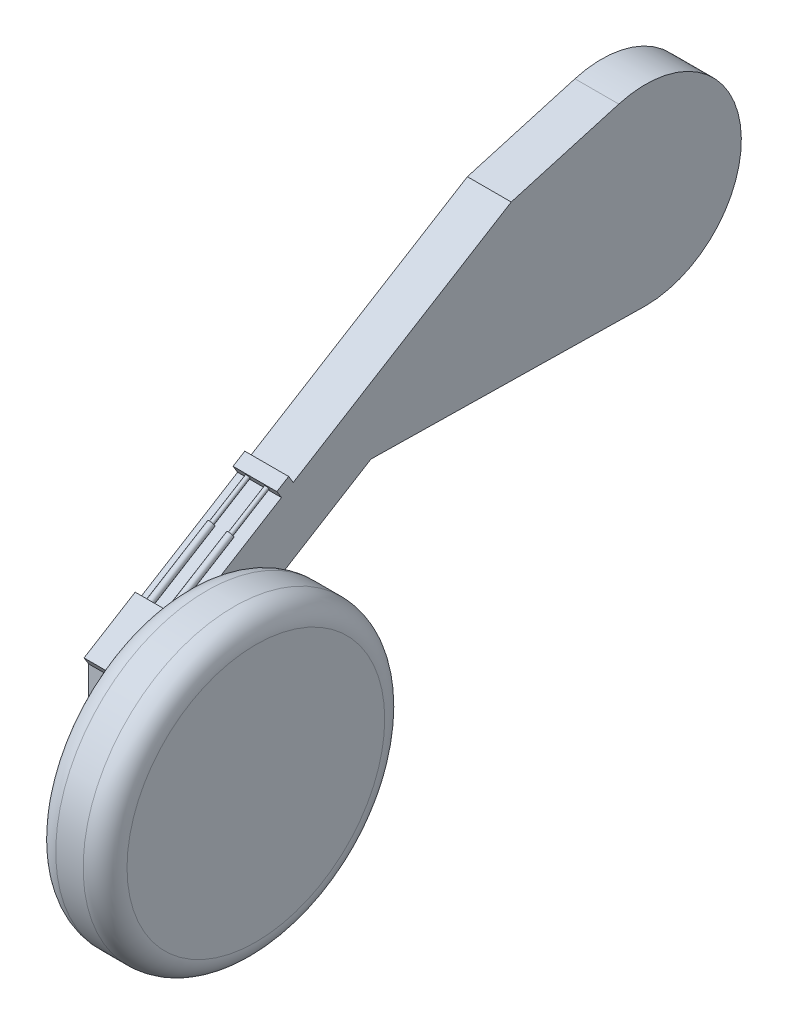
ISO-10303-21;
HEADER;
FILE_DESCRIPTION(('STEP AP214'),'2;1');
FILE_NAME('part.step','',(''),(''),'','','');
FILE_SCHEMA(('AUTOMOTIVE_DESIGN { 1 0 10303 214 1 1 1 1 }'));
ENDSEC;
DATA;
#1=APPLICATION_CONTEXT('core data for automotive mechanical design processes');
#2=APPLICATION_PROTOCOL_DEFINITION('international standard','automotive_design',2000,#1);
#3=PRODUCT_CONTEXT('',#1,'mechanical');
#4=PRODUCT('Part','Part','',(#3));
#5=PRODUCT_RELATED_PRODUCT_CATEGORY('part','',(#4));
#6=PRODUCT_DEFINITION_FORMATION('','',#4);
#7=PRODUCT_DEFINITION_CONTEXT('part definition',#1,'design');
#8=PRODUCT_DEFINITION('design','',#6,#7);
#9=PRODUCT_DEFINITION_SHAPE('','',#8);
#10=(LENGTH_UNIT() NAMED_UNIT(*) SI_UNIT(.MILLI.,.METRE.));
#11=(NAMED_UNIT(*) PLANE_ANGLE_UNIT() SI_UNIT($,.RADIAN.));
#12=(NAMED_UNIT(*) SI_UNIT($,.STERADIAN.) SOLID_ANGLE_UNIT());
#13=UNCERTAINTY_MEASURE_WITH_UNIT(LENGTH_MEASURE(1.E-05),#10,'distance_accuracy_value','');
#14=(GEOMETRIC_REPRESENTATION_CONTEXT(3) GLOBAL_UNCERTAINTY_ASSIGNED_CONTEXT((#13)) GLOBAL_UNIT_ASSIGNED_CONTEXT((#10,
#11,#12)) REPRESENTATION_CONTEXT('',''));
#15=CARTESIAN_POINT('',(0.,0.,0.));
#16=DIRECTION('',(0.,0.,1.));
#17=DIRECTION('',(1.,0.,0.));
#18=AXIS2_PLACEMENT_3D('',#15,#16,#17);
#19=CARTESIAN_POINT('',(80.,111.551826897127,244.683369843589));
#20=DIRECTION('',(0.,-0.852159096550668,-0.523282786040158));
#21=DIRECTION('',(0.,0.523282786040158,-0.852159096550668));
#22=AXIS2_PLACEMENT_3D('',#19,#20,#21);
#23=PLANE('',#22);
#24=DIRECTION('',(-1.,0.,0.));
#25=VECTOR('',#24,1.);
#26=CARTESIAN_POINT('',(80.,-255.376072355501,842.220601084286));
#27=LINE('',#26,#25);
#28=CARTESIAN_POINT('',(80.,-255.376072355501,842.220601084285));
#29=VERTEX_POINT('',#28);
#30=CARTESIAN_POINT('',(0.,-255.376072355501,842.220601084285));
#31=VERTEX_POINT('',#30);
#32=EDGE_CURVE('E68',#29,#31,#27,.T.);
#33=ORIENTED_EDGE('',*,*,#32,.F.);
#34=DIRECTION('',(0.,-0.523282786040158,0.852159096550668));
#35=VECTOR('',#34,1.);
#36=CARTESIAN_POINT('',(80.,111.551826897127,244.683369843589));
#37=LINE('',#36,#35);
#38=CARTESIAN_POINT('',(80.,-145.799478454916,663.776567088762));
#39=VERTEX_POINT('',#38);
#40=EDGE_CURVE('E227',#39,#29,#37,.T.);
#41=ORIENTED_EDGE('',*,*,#40,.F.);
#42=DIRECTION('',(1.,0.,0.));
#43=VECTOR('',#42,1.);
#44=CARTESIAN_POINT('',(80.,-145.799478454916,663.776567088762));
#45=LINE('',#44,#43);
#46=CARTESIAN_POINT('',(0.,-145.799478454916,663.776567088762));
#47=VERTEX_POINT('',#46);
#48=EDGE_CURVE('E185',#47,#39,#45,.T.);
#49=ORIENTED_EDGE('',*,*,#48,.F.);
#50=DIRECTION('',(0.,-0.523282786040158,0.852159096550668));
#51=VECTOR('',#50,1.);
#52=CARTESIAN_POINT('',(0.,111.551826897127,244.683369843589));
#53=LINE('',#52,#51);
#54=EDGE_CURVE('E72',#47,#31,#53,.T.);
#55=ORIENTED_EDGE('',*,*,#54,.T.);
#56=EDGE_LOOP('',(#33,#41,#49,#55));
#57=FACE_BOUND('',#56,.T.);
#58=ADVANCED_FACE('F51',(#57),#23,.F.);
#59=DIRECTION('',(-1.,0.,0.));
#60=VECTOR('',#59,1.);
#61=CARTESIAN_POINT('',(80.,-132.618358846783,642.311288129766));
#62=LINE('',#61,#60);
#63=CARTESIAN_POINT('',(80.,-132.618358846783,642.311288129766));
#64=VERTEX_POINT('',#63);
#65=CARTESIAN_POINT('',(0.,-132.618358846783,642.311288129766));
#66=VERTEX_POINT('',#65);
#67=EDGE_CURVE('E184',#64,#66,#62,.T.);
#68=ORIENTED_EDGE('',*,*,#67,.F.);
#69=CARTESIAN_POINT('',(80.,111.551826897127,244.683369843589));
#70=VERTEX_POINT('',#69);
#71=EDGE_CURVE('E226',#70,#64,#37,.T.);
#72=ORIENTED_EDGE('',*,*,#71,.F.);
#73=DIRECTION('',(-1.,0.,0.));
#74=VECTOR('',#73,1.);
#75=CARTESIAN_POINT('',(80.,111.551826897127,244.683369843589));
#76=LINE('',#75,#74);
#77=CARTESIAN_POINT('',(0.,111.551826897127,244.683369843589));
#78=VERTEX_POINT('',#77);
#79=EDGE_CURVE('E275',#70,#78,#76,.T.);
#80=ORIENTED_EDGE('',*,*,#79,.T.);
#81=EDGE_CURVE('E246',#78,#66,#53,.T.);
#82=ORIENTED_EDGE('',*,*,#81,.T.);
#83=EDGE_LOOP('',(#68,#72,#80,#82));
#84=FACE_BOUND('',#83,.T.);
#85=ADVANCED_FACE('F316',(#84),#23,.F.);
#86=CARTESIAN_POINT('',(80.,0.,0.));
#87=DIRECTION('',(-1.,0.,0.));
#88=DIRECTION('',(0.,0.,1.));
#89=AXIS2_PLACEMENT_3D('',#86,#87,#88);
#90=CYLINDRICAL_SURFACE('',#89,175.);
#91=CARTESIAN_POINT('',(0.,0.,0.));
#92=DIRECTION('',(1.,0.,0.));
#93=DIRECTION('',(0.,0.,-1.));
#94=AXIS2_PLACEMENT_3D('',#91,#92,#93);
#95=CIRCLE('',#94,175.);
#96=CARTESIAN_POINT('',(0.,-175.,0.));
#97=VERTEX_POINT('',#96);
#98=CARTESIAN_POINT('',(0.,168.143707762721,48.5045723597744));
#99=VERTEX_POINT('',#98);
#100=EDGE_CURVE('E217',#97,#99,#95,.T.);
#101=ORIENTED_EDGE('',*,*,#100,.T.);
#102=DIRECTION('',(-1.,0.,0.));
#103=VECTOR('',#102,1.);
#104=CARTESIAN_POINT('',(80.,168.143707762721,48.5045723597744));
#105=LINE('',#104,#103);
#106=CARTESIAN_POINT('',(80.,168.143707762721,48.5045723597744));
#107=VERTEX_POINT('',#106);
#108=EDGE_CURVE('E273',#107,#99,#105,.T.);
#109=ORIENTED_EDGE('',*,*,#108,.F.);
#110=CARTESIAN_POINT('',(80.,0.,0.));
#111=DIRECTION('',(1.,0.,0.));
#112=DIRECTION('',(0.,0.,-1.));
#113=AXIS2_PLACEMENT_3D('',#110,#111,#112);
#114=CIRCLE('',#113,175.);
#115=CARTESIAN_POINT('',(80.,-175.,0.));
#116=VERTEX_POINT('',#115);
#117=EDGE_CURVE('E222',#116,#107,#114,.T.);
#118=ORIENTED_EDGE('',*,*,#117,.F.);
#119=DIRECTION('',(-1.,0.,0.));
#120=VECTOR('',#119,1.);
#121=CARTESIAN_POINT('',(80.,-175.,0.));
#122=LINE('',#121,#120);
#123=EDGE_CURVE('E241',#116,#97,#122,.T.);
#124=ORIENTED_EDGE('',*,*,#123,.T.);
#125=EDGE_LOOP('',(#101,#109,#118,#124));
#126=FACE_BOUND('',#125,.T.);
#127=ADVANCED_FACE('F328',(#126),#90,.T.);
#128=CARTESIAN_POINT('',(80.,168.143707762721,48.5045723597744));
#129=DIRECTION('',(0.,-0.96082118721555,-0.277168984912997));
#130=DIRECTION('',(0.,0.277168984912997,-0.96082118721555));
#131=AXIS2_PLACEMENT_3D('',#128,#129,#130);
#132=PLANE('',#131);
#133=DIRECTION('',(0.,-0.277168984912997,0.96082118721555));
#134=VECTOR('',#133,1.);
#135=CARTESIAN_POINT('',(0.,168.143707762721,48.5045723597744));
#136=LINE('',#135,#134);
#137=EDGE_CURVE('E242',#99,#78,#136,.T.);
#138=ORIENTED_EDGE('',*,*,#137,.T.);
#139=ORIENTED_EDGE('',*,*,#79,.F.);
#140=DIRECTION('',(0.,-0.277168984912997,0.96082118721555));
#141=VECTOR('',#140,1.);
#142=CARTESIAN_POINT('',(80.,168.143707762721,48.5045723597744));
#143=LINE('',#142,#141);
#144=EDGE_CURVE('E221',#107,#70,#143,.T.);
#145=ORIENTED_EDGE('',*,*,#144,.F.);
#146=ORIENTED_EDGE('',*,*,#108,.T.);
#147=EDGE_LOOP('',(#138,#139,#145,#146));
#148=FACE_BOUND('',#147,.T.);
#149=ADVANCED_FACE('F334',(#148),#132,.F.);
#150=CARTESIAN_POINT('',(80.,-312.643858609651,935.480433621654));
#151=DIRECTION('',(0.,0.,-1.));
#152=DIRECTION('',(-1.,0.,0.));
#153=AXIS2_PLACEMENT_3D('',#150,#151,#152);
#154=PLANE('',#153);
#155=DIRECTION('',(0.,-1.,0.));
#156=VECTOR('',#155,1.);
#157=CARTESIAN_POINT('',(0.,-312.643858609651,935.480433621654));
#158=LINE('',#157,#156);
#159=CARTESIAN_POINT('',(0.,-312.64385860965,935.480433621654));
#160=VERTEX_POINT('',#159);
#161=CARTESIAN_POINT('',(0.,-439.61826921909,935.480433621654));
#162=VERTEX_POINT('',#161);
#163=EDGE_CURVE('E179',#160,#162,#158,.T.);
#164=ORIENTED_EDGE('',*,*,#163,.T.);
#165=DIRECTION('',(-1.,0.,0.));
#166=VECTOR('',#165,1.);
#167=CARTESIAN_POINT('',(80.,-439.61826921909,935.480433621654));
#168=LINE('',#167,#166);
#169=CARTESIAN_POINT('',(80.,-439.61826921909,935.480433621654));
#170=VERTEX_POINT('',#169);
#171=EDGE_CURVE('E269',#170,#162,#168,.T.);
#172=ORIENTED_EDGE('',*,*,#171,.F.);
#173=DIRECTION('',(0.,-1.,0.));
#174=VECTOR('',#173,1.);
#175=CARTESIAN_POINT('',(80.,-312.643858609651,935.480433621654));
#176=LINE('',#175,#174);
#177=CARTESIAN_POINT('',(80.,-312.643858609651,935.480433621654));
#178=VERTEX_POINT('',#177);
#179=EDGE_CURVE('E233',#178,#170,#176,.T.);
#180=ORIENTED_EDGE('',*,*,#179,.F.);
#181=DIRECTION('',(-1.,0.,0.));
#182=VECTOR('',#181,1.);
#183=CARTESIAN_POINT('',(80.,-312.643858609651,935.480433621654));
#184=LINE('',#183,#182);
#185=EDGE_CURVE('E268',#178,#160,#184,.T.);
#186=ORIENTED_EDGE('',*,*,#185,.T.);
#187=EDGE_LOOP('',(#164,#172,#180,#186));
#188=FACE_BOUND('',#187,.T.);
#189=ADVANCED_FACE('F326',(#188),#154,.F.);
#190=CARTESIAN_POINT('',(80.,-439.61826921909,935.480433621654));
#191=DIRECTION('',(0.,1.,0.));
#192=DIRECTION('',(0.,0.,1.));
#193=AXIS2_PLACEMENT_3D('',#190,#191,#192);
#194=PLANE('',#193);
#195=DIRECTION('',(0.,0.,-1.));
#196=VECTOR('',#195,1.);
#197=CARTESIAN_POINT('',(0.,-439.61826921909,935.480433621654));
#198=LINE('',#197,#196);
#199=CARTESIAN_POINT('',(0.,-439.61826921909,846.646989911415));
#200=VERTEX_POINT('',#199);
#201=EDGE_CURVE('E248',#162,#200,#198,.T.);
#202=ORIENTED_EDGE('',*,*,#201,.T.);
#203=DIRECTION('',(-1.,0.,0.));
#204=VECTOR('',#203,1.);
#205=CARTESIAN_POINT('',(80.,-439.61826921909,846.646989911415));
#206=LINE('',#205,#204);
#207=CARTESIAN_POINT('',(80.,-439.61826921909,846.646989911415));
#208=VERTEX_POINT('',#207);
#209=EDGE_CURVE('E265',#208,#200,#206,.T.);
#210=ORIENTED_EDGE('',*,*,#209,.F.);
#211=DIRECTION('',(0.,0.,-1.));
#212=VECTOR('',#211,1.);
#213=CARTESIAN_POINT('',(80.,-439.61826921909,935.480433621654));
#214=LINE('',#213,#212);
#215=EDGE_CURVE('E231',#170,#208,#214,.T.);
#216=ORIENTED_EDGE('',*,*,#215,.F.);
#217=ORIENTED_EDGE('',*,*,#171,.T.);
#218=EDGE_LOOP('',(#202,#210,#216,#217));
#219=FACE_BOUND('',#218,.T.);
#220=ADVANCED_FACE('F362',(#219),#194,.F.);
#221=CARTESIAN_POINT('',(80.,-439.61826921909,846.646989911415));
#222=DIRECTION('',(0.,0.,1.));
#223=DIRECTION('',(1.,0.,0.));
#224=AXIS2_PLACEMENT_3D('',#221,#222,#223);
#225=PLANE('',#224);
#226=DIRECTION('',(0.,1.,0.));
#227=VECTOR('',#226,1.);
#228=CARTESIAN_POINT('',(0.,-439.61826921909,846.646989911415));
#229=LINE('',#228,#227);
#230=CARTESIAN_POINT('',(0.,-379.079220955494,846.646989911415));
#231=VERTEX_POINT('',#230);
#232=EDGE_CURVE('E252',#200,#231,#229,.T.);
#233=ORIENTED_EDGE('',*,*,#232,.T.);
#234=DIRECTION('',(-1.,0.,0.));
#235=VECTOR('',#234,1.);
#236=CARTESIAN_POINT('',(80.,-379.079220955494,846.646989911415));
#237=LINE('',#236,#235);
#238=CARTESIAN_POINT('',(80.,-379.079220955494,846.646989911415));
#239=VERTEX_POINT('',#238);
#240=EDGE_CURVE('E263',#239,#231,#237,.T.);
#241=ORIENTED_EDGE('',*,*,#240,.F.);
#242=DIRECTION('',(0.,1.,0.));
#243=VECTOR('',#242,1.);
#244=CARTESIAN_POINT('',(80.,-439.61826921909,846.646989911415));
#245=LINE('',#244,#243);
#246=EDGE_CURVE('E232',#208,#239,#245,.T.);
#247=ORIENTED_EDGE('',*,*,#246,.F.);
#248=ORIENTED_EDGE('',*,*,#209,.T.);
#249=EDGE_LOOP('',(#233,#241,#247,#248));
#250=FACE_BOUND('',#249,.T.);
#251=ADVANCED_FACE('F359',(#250),#225,.F.);
#252=CARTESIAN_POINT('',(80.,-379.079220955494,846.646989911415));
#253=DIRECTION('',(0.,0.852159096550668,0.523282786040158));
#254=DIRECTION('',(0.,-0.523282786040158,0.852159096550668));
#255=AXIS2_PLACEMENT_3D('',#252,#253,#254);
#256=PLANE('',#255);
#257=DIRECTION('',(0.,0.523282786040158,-0.852159096550668));
#258=VECTOR('',#257,1.);
#259=CARTESIAN_POINT('',(0.,-379.079220955494,846.646989911415));
#260=LINE('',#259,#258);
#261=CARTESIAN_POINT('',(0.,-166.597246218657,500.622904167558));
#262=VERTEX_POINT('',#261);
#263=EDGE_CURVE('E254',#231,#262,#260,.T.);
#264=ORIENTED_EDGE('',*,*,#263,.T.);
#265=DIRECTION('',(-1.,0.,0.));
#266=VECTOR('',#265,1.);
#267=CARTESIAN_POINT('',(80.,-166.597246218657,500.622904167558));
#268=LINE('',#267,#266);
#269=CARTESIAN_POINT('',(80.,-166.597246218657,500.622904167558));
#270=VERTEX_POINT('',#269);
#271=EDGE_CURVE('E260',#270,#262,#268,.T.);
#272=ORIENTED_EDGE('',*,*,#271,.F.);
#273=DIRECTION('',(0.,0.523282786040158,-0.852159096550668));
#274=VECTOR('',#273,1.);
#275=CARTESIAN_POINT('',(80.,-379.079220955494,846.646989911415));
#276=LINE('',#275,#274);
#277=EDGE_CURVE('E240',#239,#270,#276,.T.);
#278=ORIENTED_EDGE('',*,*,#277,.F.);
#279=ORIENTED_EDGE('',*,*,#240,.T.);
#280=EDGE_LOOP('',(#264,#272,#278,#279));
#281=FACE_BOUND('',#280,.T.);
#282=ADVANCED_FACE('F358',(#281),#256,.F.);
#283=CARTESIAN_POINT('',(80.,-166.597246218657,500.622904167558));
#284=DIRECTION('',(0.,0.999859168404788,-0.016782233370033));
#285=DIRECTION('',(0.,0.016782233370033,0.999859168404788));
#286=AXIS2_PLACEMENT_3D('',#283,#284,#285);
#287=PLANE('',#286);
#288=DIRECTION('',(0.,-0.016782233370033,-0.999859168404788));
#289=VECTOR('',#288,1.);
#290=CARTESIAN_POINT('',(0.,-166.597246218657,500.622904167558));
#291=LINE('',#290,#289);
#292=EDGE_CURVE('E223',#262,#97,#291,.T.);
#293=ORIENTED_EDGE('',*,*,#292,.T.);
#294=ORIENTED_EDGE('',*,*,#123,.F.);
#295=DIRECTION('',(0.,-0.016782233370033,-0.999859168404788));
#296=VECTOR('',#295,1.);
#297=CARTESIAN_POINT('',(80.,-166.597246218657,500.622904167558));
#298=LINE('',#297,#296);
#299=EDGE_CURVE('E237',#270,#116,#298,.T.);
#300=ORIENTED_EDGE('',*,*,#299,.F.);
#301=ORIENTED_EDGE('',*,*,#271,.T.);
#302=EDGE_LOOP('',(#293,#294,#300,#301));
#303=FACE_BOUND('',#302,.T.);
#304=ADVANCED_FACE('F351',(#303),#287,.F.);
#305=CARTESIAN_POINT('',(80.,0.,0.));
#306=DIRECTION('',(1.,0.,0.));
#307=DIRECTION('',(0.,0.,-1.));
#308=AXIS2_PLACEMENT_3D('',#305,#306,#307);
#309=PLANE('',#308);
#310=CARTESIAN_POINT('',(80.,-409.61826921909,890.480433621654));
#311=DIRECTION('',(1.,0.,0.));
#312=DIRECTION('',(0.,0.,-1.));
#313=AXIS2_PLACEMENT_3D('',#310,#311,#312);
#314=CIRCLE('',#313,20.);
#315=CARTESIAN_POINT('',(80.,-409.61826921909,870.480433621654));
#316=VERTEX_POINT('',#315);
#317=EDGE_CURVE('E696',#316,#316,#314,.T.);
#318=ORIENTED_EDGE('',*,*,#317,.F.);
#319=EDGE_LOOP('',(#318));
#320=FACE_BOUND('',#319,.T.);
#321=ORIENTED_EDGE('',*,*,#117,.T.);
#322=ORIENTED_EDGE('',*,*,#144,.T.);
#323=ORIENTED_EDGE('',*,*,#71,.T.);
#324=DIRECTION('',(0.,-0.852159096550668,-0.523282786040158));
#325=VECTOR('',#324,1.);
#326=CARTESIAN_POINT('',(80.,-118.983813301972,650.683812706408));
#327=LINE('',#326,#325);
#328=CARTESIAN_POINT('',(80.,-118.983813301972,650.683812706408));
#329=VERTEX_POINT('',#328);
#330=EDGE_CURVE('E203',#329,#64,#327,.T.);
#331=ORIENTED_EDGE('',*,*,#330,.F.);
#332=DIRECTION('',(0.,0.523282786040158,-0.852159096550668));
#333=VECTOR('',#332,1.);
#334=CARTESIAN_POINT('',(80.,-118.983813301972,650.683812706408));
#335=LINE('',#334,#333);
#336=CARTESIAN_POINT('',(80.,-132.164932910105,672.149091665405));
#337=VERTEX_POINT('',#336);
#338=EDGE_CURVE('E198',#337,#329,#335,.T.);
#339=ORIENTED_EDGE('',*,*,#338,.F.);
#340=DIRECTION('',(0.,-0.852159096550668,-0.523282786040158));
#341=VECTOR('',#340,1.);
#342=CARTESIAN_POINT('',(80.,-132.164932910105,672.149091665405));
#343=LINE('',#342,#341);
#344=EDGE_CURVE('E206',#337,#39,#343,.T.);
#345=ORIENTED_EDGE('',*,*,#344,.T.);
#346=ORIENTED_EDGE('',*,*,#40,.T.);
#347=DIRECTION('',(0.,-0.852159096550668,-0.523282786040158));
#348=VECTOR('',#347,1.);
#349=CARTESIAN_POINT('',(80.,-241.74152681069,850.593125660928));
#350=LINE('',#349,#348);
#351=CARTESIAN_POINT('',(80.,-241.74152681069,850.593125660928));
#352=VERTEX_POINT('',#351);
#353=EDGE_CURVE('E190',#352,#29,#350,.T.);
#354=ORIENTED_EDGE('',*,*,#353,.F.);
#355=DIRECTION('',(0.,0.523282786040158,-0.852159096550667));
#356=VECTOR('',#355,1.);
#357=CARTESIAN_POINT('',(80.,-241.74152681069,850.593125660928));
#358=LINE('',#357,#356);
#359=CARTESIAN_POINT('',(80.,-299.00931306484,943.852958198297));
#360=VERTEX_POINT('',#359);
#361=EDGE_CURVE('E168',#360,#352,#358,.T.);
#362=ORIENTED_EDGE('',*,*,#361,.F.);
#363=DIRECTION('',(0.,-0.852159096550668,-0.523282786040158));
#364=VECTOR('',#363,1.);
#365=CARTESIAN_POINT('',(80.,-299.00931306484,943.852958198297));
#366=LINE('',#365,#364);
#367=EDGE_CURVE('E161',#360,#178,#366,.T.);
#368=ORIENTED_EDGE('',*,*,#367,.T.);
#369=ORIENTED_EDGE('',*,*,#179,.T.);
#370=ORIENTED_EDGE('',*,*,#215,.T.);
#371=ORIENTED_EDGE('',*,*,#246,.T.);
#372=ORIENTED_EDGE('',*,*,#277,.T.);
#373=ORIENTED_EDGE('',*,*,#299,.T.);
#374=EDGE_LOOP('',(#321,#322,#323,#331,#339,#345,#346,#354,#362,#368,#369,#370,#371,#372,#373));
#375=FACE_BOUND('',#374,.T.);
#376=ADVANCED_FACE('F350',(#320,#375),#309,.T.);
#377=CARTESIAN_POINT('',(0.,0.,0.));
#378=DIRECTION('',(1.,0.,0.));
#379=DIRECTION('',(0.,0.,-1.));
#380=AXIS2_PLACEMENT_3D('',#377,#378,#379);
#381=PLANE('',#380);
#382=CARTESIAN_POINT('',(0.,0.,0.));
#383=DIRECTION('',(-1.,0.,0.));
#384=DIRECTION('',(0.,0.,1.));
#385=AXIS2_PLACEMENT_3D('',#382,#383,#384);
#386=CIRCLE('',#385,50.);
#387=CARTESIAN_POINT('',(0.,0.,50.));
#388=VERTEX_POINT('',#387);
#389=EDGE_CURVE('E213',#388,#388,#386,.T.);
#390=ORIENTED_EDGE('',*,*,#389,.F.);
#391=EDGE_LOOP('',(#390));
#392=FACE_BOUND('',#391,.T.);
#393=ORIENTED_EDGE('',*,*,#100,.F.);
#394=ORIENTED_EDGE('',*,*,#292,.F.);
#395=ORIENTED_EDGE('',*,*,#263,.F.);
#396=ORIENTED_EDGE('',*,*,#232,.F.);
#397=ORIENTED_EDGE('',*,*,#201,.F.);
#398=ORIENTED_EDGE('',*,*,#163,.F.);
#399=DIRECTION('',(0.,-0.852159096550668,-0.523282786040158));
#400=VECTOR('',#399,1.);
#401=CARTESIAN_POINT('',(0.,-299.00931306484,943.852958198297));
#402=LINE('',#401,#400);
#403=CARTESIAN_POINT('',(0.,-299.00931306484,943.852958198297));
#404=VERTEX_POINT('',#403);
#405=EDGE_CURVE('E163',#404,#160,#402,.T.);
#406=ORIENTED_EDGE('',*,*,#405,.F.);
#407=DIRECTION('',(0.,-0.523282786040158,0.852159096550667));
#408=VECTOR('',#407,1.);
#409=CARTESIAN_POINT('',(0.,-241.74152681069,850.593125660928));
#410=LINE('',#409,#408);
#411=CARTESIAN_POINT('',(0.,-241.74152681069,850.593125660928));
#412=VERTEX_POINT('',#411);
#413=EDGE_CURVE('E170',#412,#404,#410,.T.);
#414=ORIENTED_EDGE('',*,*,#413,.F.);
#415=DIRECTION('',(0.,-0.852159096550668,-0.523282786040158));
#416=VECTOR('',#415,1.);
#417=CARTESIAN_POINT('',(0.,-241.74152681069,850.593125660928));
#418=LINE('',#417,#416);
#419=EDGE_CURVE('E371',#412,#31,#418,.T.);
#420=ORIENTED_EDGE('',*,*,#419,.T.);
#421=ORIENTED_EDGE('',*,*,#54,.F.);
#422=DIRECTION('',(0.,-0.852159096550668,-0.523282786040158));
#423=VECTOR('',#422,1.);
#424=CARTESIAN_POINT('',(0.,-132.164932910105,672.149091665405));
#425=LINE('',#424,#423);
#426=CARTESIAN_POINT('',(0.,-132.164932910105,672.149091665405));
#427=VERTEX_POINT('',#426);
#428=EDGE_CURVE('E214',#427,#47,#425,.T.);
#429=ORIENTED_EDGE('',*,*,#428,.F.);
#430=DIRECTION('',(0.,-0.523282786040158,0.852159096550668));
#431=VECTOR('',#430,1.);
#432=CARTESIAN_POINT('',(0.,-118.983813301972,650.683812706408));
#433=LINE('',#432,#431);
#434=CARTESIAN_POINT('',(0.,-118.983813301972,650.683812706408));
#435=VERTEX_POINT('',#434);
#436=EDGE_CURVE('E194',#435,#427,#433,.T.);
#437=ORIENTED_EDGE('',*,*,#436,.F.);
#438=DIRECTION('',(0.,-0.852159096550668,-0.523282786040158));
#439=VECTOR('',#438,1.);
#440=CARTESIAN_POINT('',(0.,-118.983813301972,650.683812706408));
#441=LINE('',#440,#439);
#442=EDGE_CURVE('E200',#435,#66,#441,.T.);
#443=ORIENTED_EDGE('',*,*,#442,.T.);
#444=ORIENTED_EDGE('',*,*,#81,.F.);
#445=ORIENTED_EDGE('',*,*,#137,.F.);
#446=EDGE_LOOP('',(#393,#394,#395,#396,#397,#398,#406,#414,#420,#421,#429,#437,#443,#444,#445));
#447=FACE_BOUND('',#446,.T.);
#448=ADVANCED_FACE('F178',(#392,#447),#381,.F.);
#449=CARTESIAN_POINT('',(60.,0.,0.));
#450=DIRECTION('',(-1.,0.,0.));
#451=DIRECTION('',(0.,0.,1.));
#452=AXIS2_PLACEMENT_3D('',#449,#450,#451);
#453=CYLINDRICAL_SURFACE('',#452,50.);
#454=CARTESIAN_POINT('',(60.,0.,0.));
#455=DIRECTION('',(-1.,0.,0.));
#456=DIRECTION('',(0.,0.,1.));
#457=AXIS2_PLACEMENT_3D('',#454,#455,#456);
#458=CIRCLE('',#457,50.);
#459=CARTESIAN_POINT('',(60.,0.,50.));
#460=VERTEX_POINT('',#459);
#461=EDGE_CURVE('E212',#460,#460,#458,.T.);
#462=CARTESIAN_POINT('',(60.,0.,50.));
#463=CARTESIAN_POINT('',(59.375,0.,50.));
#464=CARTESIAN_POINT('',(58.75,0.,50.));
#465=CARTESIAN_POINT('',(57.5,0.,50.));
#466=CARTESIAN_POINT('',(56.875,0.,50.));
#467=CARTESIAN_POINT('',(55.625,0.,50.));
#468=CARTESIAN_POINT('',(55.,0.,50.));
#469=CARTESIAN_POINT('',(53.75,0.,50.));
#470=CARTESIAN_POINT('',(53.125,0.,50.));
#471=CARTESIAN_POINT('',(51.875,0.,50.));
#472=CARTESIAN_POINT('',(51.25,0.,50.));
#473=CARTESIAN_POINT('',(50.,0.,50.));
#474=CARTESIAN_POINT('',(49.375,0.,50.));
#475=CARTESIAN_POINT('',(48.125,0.,50.));
#476=CARTESIAN_POINT('',(47.5,0.,50.));
#477=CARTESIAN_POINT('',(46.25,0.,50.));
#478=CARTESIAN_POINT('',(45.625,0.,50.));
#479=CARTESIAN_POINT('',(44.375,0.,50.));
#480=CARTESIAN_POINT('',(43.75,0.,50.));
#481=CARTESIAN_POINT('',(42.5,0.,50.));
#482=CARTESIAN_POINT('',(41.875,0.,50.));
#483=CARTESIAN_POINT('',(40.625,0.,50.));
#484=CARTESIAN_POINT('',(40.,0.,50.));
#485=CARTESIAN_POINT('',(38.75,0.,50.));
#486=CARTESIAN_POINT('',(38.125,0.,50.));
#487=CARTESIAN_POINT('',(36.875,0.,50.));
#488=CARTESIAN_POINT('',(36.25,0.,50.));
#489=CARTESIAN_POINT('',(35.,0.,50.));
#490=CARTESIAN_POINT('',(34.375,0.,50.));
#491=CARTESIAN_POINT('',(33.125,0.,50.));
#492=CARTESIAN_POINT('',(32.5,0.,50.));
#493=CARTESIAN_POINT('',(31.25,0.,50.));
#494=CARTESIAN_POINT('',(30.625,0.,50.));
#495=CARTESIAN_POINT('',(29.375,0.,50.));
#496=CARTESIAN_POINT('',(28.75,0.,50.));
#497=CARTESIAN_POINT('',(27.5,0.,50.));
#498=CARTESIAN_POINT('',(26.875,0.,50.));
#499=CARTESIAN_POINT('',(25.625,0.,50.));
#500=CARTESIAN_POINT('',(25.,0.,50.));
#501=CARTESIAN_POINT('',(23.75,0.,50.));
#502=CARTESIAN_POINT('',(23.125,0.,50.));
#503=CARTESIAN_POINT('',(21.875,0.,50.));
#504=CARTESIAN_POINT('',(21.25,0.,50.));
#505=CARTESIAN_POINT('',(20.,0.,50.));
#506=CARTESIAN_POINT('',(19.375,0.,50.));
#507=CARTESIAN_POINT('',(18.125,0.,50.));
#508=CARTESIAN_POINT('',(17.5,0.,50.));
#509=CARTESIAN_POINT('',(16.25,0.,50.));
#510=CARTESIAN_POINT('',(15.625,0.,50.));
#511=CARTESIAN_POINT('',(14.375,0.,50.));
#512=CARTESIAN_POINT('',(13.75,0.,50.));
#513=CARTESIAN_POINT('',(12.5,0.,50.));
#514=CARTESIAN_POINT('',(11.875,0.,50.));
#515=CARTESIAN_POINT('',(10.625,0.,50.));
#516=CARTESIAN_POINT('',(10.,0.,50.));
#517=CARTESIAN_POINT('',(8.75,0.,50.));
#518=CARTESIAN_POINT('',(8.125,0.,50.));
#519=CARTESIAN_POINT('',(6.875,0.,50.));
#520=CARTESIAN_POINT('',(6.25,0.,50.));
#521=CARTESIAN_POINT('',(5.,0.,50.));
#522=CARTESIAN_POINT('',(4.375,0.,50.));
#523=CARTESIAN_POINT('',(3.125,0.,50.));
#524=CARTESIAN_POINT('',(2.5,0.,50.));
#525=CARTESIAN_POINT('',(1.25,0.,50.));
#526=CARTESIAN_POINT('',(0.625000000000001,0.,50.));
#527=CARTESIAN_POINT('',(0.,0.,50.));
#528=B_SPLINE_CURVE_WITH_KNOTS('',3,(#462,#463,#464,#465,#466,#467,#468,#469,#470,#471,#472,
#473,#474,#475,#476,#477,#478,#479,#480,#481,#482,#483,#484,#485,#486,#487,#488,#489,#490,#491,
#492,#493,#494,#495,#496,#497,#498,#499,#500,#501,#502,#503,#504,#505,#506,#507,#508,#509,#510,
#511,#512,#513,#514,#515,#516,#517,#518,#519,#520,#521,#522,#523,#524,#525,#526,#527),
.UNSPECIFIED.,.F.,.F.,(4,2,2,2,2,2,2,2,2,2,2,2,2,2,2,2,2,2,2,2,2,2,2,2,2,2,2,2,2,2,2,2,4),(0.,
1.875,3.75,5.62500000000001,7.50000000000001,9.37500000000001,11.25,13.125,15.,16.875,18.75,
20.625,22.5,24.375,26.25,28.125,30.,31.875,33.75,35.625,37.5,39.375,41.25,43.125,45.,46.875,
48.75,50.625,52.5,54.375,56.25,58.125,60.),.UNSPECIFIED.);
#529=EDGE_CURVE('BSEAM404',#460,#388,#528,.T.);
#530=ORIENTED_EDGE('',*,*,#461,.F.);
#531=ORIENTED_EDGE('',*,*,#389,.T.);
#532=ORIENTED_EDGE('',*,*,#529,.T.);
#533=ORIENTED_EDGE('',*,*,#529,.F.);
#534=EDGE_LOOP('',(#530,#532,#531,#533));
#535=FACE_BOUND('',#534,.T.);
#536=ADVANCED_FACE('F404',(#535),#453,.F.);
#537=CARTESIAN_POINT('',(60.,0.,0.));
#538=DIRECTION('',(-1.,0.,0.));
#539=DIRECTION('',(0.,0.,1.));
#540=AXIS2_PLACEMENT_3D('',#537,#538,#539);
#541=PLANE('',#540);
#542=ORIENTED_EDGE('',*,*,#461,.T.);
#543=EDGE_LOOP('',(#542));
#544=FACE_BOUND('',#543,.T.);
#545=ADVANCED_FACE('F399',(#544),#541,.T.);
#546=CARTESIAN_POINT('',(80.,-132.164932910105,672.149091665405));
#547=DIRECTION('',(0.,0.523282786040158,-0.852159096550668));
#548=DIRECTION('',(0.,0.852159096550668,0.523282786040158));
#549=AXIS2_PLACEMENT_3D('',#546,#547,#548);
#550=PLANE('',#549);
#551=CARTESIAN_POINT('',(22.6697417357448,-139.113163714992,667.882412370014));
#552=DIRECTION('',(0.,0.523282786040158,-0.852159096550668));
#553=DIRECTION('',(0.,0.852159096550668,0.523282786040158));
#554=AXIS2_PLACEMENT_3D('',#551,#552,#553);
#555=CIRCLE('',#554,3.83461042533692);
#556=CARTESIAN_POINT('',(22.6697417357448,-135.845465559313,669.888997996763));
#557=VERTEX_POINT('',#556);
#558=EDGE_CURVE('E283',#557,#557,#555,.F.);
#559=ORIENTED_EDGE('',*,*,#558,.F.);
#560=EDGE_LOOP('',(#559));
#561=FACE_BOUND('',#560,.T.);
#562=CARTESIAN_POINT('',(57.3302582642552,-139.113163714992,667.882412370014));
#563=DIRECTION('',(0.,0.523282786040158,-0.852159096550668));
#564=DIRECTION('',(0.,0.852159096550668,0.523282786040158));
#565=AXIS2_PLACEMENT_3D('',#562,#563,#564);
#566=CIRCLE('',#565,3.83461042533692);
#567=CARTESIAN_POINT('',(57.3302582642552,-135.845465559313,669.888997996763));
#568=VERTEX_POINT('',#567);
#569=EDGE_CURVE('E280',#568,#568,#566,.F.);
#570=ORIENTED_EDGE('',*,*,#569,.F.);
#571=EDGE_LOOP('',(#570));
#572=FACE_BOUND('',#571,.T.);
#573=ORIENTED_EDGE('',*,*,#48,.T.);
#574=ORIENTED_EDGE('',*,*,#344,.F.);
#575=DIRECTION('',(1.,0.,0.));
#576=VECTOR('',#575,1.);
#577=CARTESIAN_POINT('',(80.,-132.164932910105,672.149091665405));
#578=LINE('',#577,#576);
#579=EDGE_CURVE('E193',#427,#337,#578,.T.);
#580=ORIENTED_EDGE('',*,*,#579,.F.);
#581=ORIENTED_EDGE('',*,*,#428,.T.);
#582=EDGE_LOOP('',(#573,#574,#580,#581));
#583=FACE_BOUND('',#582,.T.);
#584=ADVANCED_FACE('F385',(#561,#572,#583),#550,.F.);
#585=CARTESIAN_POINT('',(80.,-118.983813301972,650.683812706408));
#586=DIRECTION('',(0.,-0.523282786040158,0.852159096550668));
#587=DIRECTION('',(0.,-0.852159096550668,-0.523282786040158));
#588=AXIS2_PLACEMENT_3D('',#585,#586,#587);
#589=PLANE('',#588);
#590=ORIENTED_EDGE('',*,*,#67,.T.);
#591=ORIENTED_EDGE('',*,*,#442,.F.);
#592=DIRECTION('',(-1.,0.,0.));
#593=VECTOR('',#592,1.);
#594=CARTESIAN_POINT('',(80.,-118.983813301972,650.683812706408));
#595=LINE('',#594,#593);
#596=EDGE_CURVE('E197',#329,#435,#595,.T.);
#597=ORIENTED_EDGE('',*,*,#596,.F.);
#598=ORIENTED_EDGE('',*,*,#330,.T.);
#599=EDGE_LOOP('',(#590,#591,#597,#598));
#600=FACE_BOUND('',#599,.T.);
#601=ADVANCED_FACE('F388',(#600),#589,.F.);
#602=CARTESIAN_POINT('',(0.,203.749961317711,125.116128954644));
#603=DIRECTION('',(0.,-0.852159096550668,-0.523282786040158));
#604=DIRECTION('',(0.,0.523282786040158,-0.852159096550668));
#605=AXIS2_PLACEMENT_3D('',#602,#603,#604);
#606=PLANE('',#605);
#607=ORIENTED_EDGE('',*,*,#436,.T.);
#608=ORIENTED_EDGE('',*,*,#579,.T.);
#609=ORIENTED_EDGE('',*,*,#338,.T.);
#610=ORIENTED_EDGE('',*,*,#596,.T.);
#611=EDGE_LOOP('',(#607,#608,#609,#610));
#612=FACE_BOUND('',#611,.T.);
#613=ADVANCED_FACE('F383',(#612),#606,.F.);
#614=CARTESIAN_POINT('',(80.,-299.00931306484,943.852958198297));
#615=DIRECTION('',(0.,0.523282786040158,-0.852159096550668));
#616=DIRECTION('',(0.,0.852159096550668,0.523282786040158));
#617=AXIS2_PLACEMENT_3D('',#614,#615,#616);
#618=PLANE('',#617);
#619=ORIENTED_EDGE('',*,*,#185,.F.);
#620=ORIENTED_EDGE('',*,*,#367,.F.);
#621=DIRECTION('',(1.,0.,0.));
#622=VECTOR('',#621,1.);
#623=CARTESIAN_POINT('',(80.,-299.00931306484,943.852958198297));
#624=LINE('',#623,#622);
#625=EDGE_CURVE('E157',#404,#360,#624,.T.);
#626=ORIENTED_EDGE('',*,*,#625,.F.);
#627=ORIENTED_EDGE('',*,*,#405,.T.);
#628=EDGE_LOOP('',(#619,#620,#626,#627));
#629=FACE_BOUND('',#628,.T.);
#630=ADVANCED_FACE('F156',(#629),#618,.F.);
#631=CARTESIAN_POINT('',(80.,-241.74152681069,850.593125660928));
#632=DIRECTION('',(0.,-0.523282786040158,0.852159096550668));
#633=DIRECTION('',(0.,-0.852159096550668,-0.523282786040158));
#634=AXIS2_PLACEMENT_3D('',#631,#632,#633);
#635=PLANE('',#634);
#636=CARTESIAN_POINT('',(22.6697417357448,-248.689757615577,846.326446365538));
#637=DIRECTION('',(0.,-0.523282786040158,0.852159096550668));
#638=DIRECTION('',(0.,-0.852159096550668,-0.523282786040158));
#639=AXIS2_PLACEMENT_3D('',#636,#637,#638);
#640=CIRCLE('',#639,6.00000000000001);
#641=CARTESIAN_POINT('',(22.6697417357448,-253.802712194881,843.186749649297));
#642=VERTEX_POINT('',#641);
#643=EDGE_CURVE('E289',#642,#642,#640,.F.);
#644=ORIENTED_EDGE('',*,*,#643,.F.);
#645=EDGE_LOOP('',(#644));
#646=FACE_BOUND('',#645,.T.);
#647=CARTESIAN_POINT('',(57.3302582642552,-248.689757615577,846.326446365538));
#648=DIRECTION('',(0.,-0.523282786040158,0.852159096550668));
#649=DIRECTION('',(0.,-0.852159096550668,-0.523282786040158));
#650=AXIS2_PLACEMENT_3D('',#647,#648,#649);
#651=CIRCLE('',#650,6.00000000000001);
#652=CARTESIAN_POINT('',(57.3302582642552,-253.802712194881,843.186749649297));
#653=VERTEX_POINT('',#652);
#654=EDGE_CURVE('E285',#653,#653,#651,.F.);
#655=ORIENTED_EDGE('',*,*,#654,.F.);
#656=EDGE_LOOP('',(#655));
#657=FACE_BOUND('',#656,.T.);
#658=ORIENTED_EDGE('',*,*,#32,.T.);
#659=ORIENTED_EDGE('',*,*,#419,.F.);
#660=DIRECTION('',(-1.,0.,0.));
#661=VECTOR('',#660,1.);
#662=CARTESIAN_POINT('',(80.,-241.74152681069,850.593125660928));
#663=LINE('',#662,#661);
#664=EDGE_CURVE('E175',#352,#412,#663,.T.);
#665=ORIENTED_EDGE('',*,*,#664,.F.);
#666=ORIENTED_EDGE('',*,*,#353,.T.);
#667=EDGE_LOOP('',(#658,#659,#665,#666));
#668=FACE_BOUND('',#667,.T.);
#669=ADVANCED_FACE('F380',(#646,#657,#668),#635,.F.);
#670=CARTESIAN_POINT('',(0.,203.749961317711,125.116128954644));
#671=DIRECTION('',(0.,-0.852159096550667,-0.523282786040158));
#672=DIRECTION('',(0.,0.523282786040158,-0.852159096550667));
#673=AXIS2_PLACEMENT_3D('',#670,#671,#672);
#674=PLANE('',#673);
#675=ORIENTED_EDGE('',*,*,#413,.T.);
#676=ORIENTED_EDGE('',*,*,#625,.T.);
#677=ORIENTED_EDGE('',*,*,#361,.T.);
#678=ORIENTED_EDGE('',*,*,#664,.T.);
#679=EDGE_LOOP('',(#675,#676,#677,#678));
#680=FACE_BOUND('',#679,.T.);
#681=ADVANCED_FACE('F167',(#680),#674,.F.);
#682=CARTESIAN_POINT('',(57.3302582642552,-179.929221026124,734.350821900966));
#683=DIRECTION('',(0.,0.523282786040158,-0.852159096550668));
#684=DIRECTION('',(0.,0.852159096550668,0.523282786040158));
#685=AXIS2_PLACEMENT_3D('',#682,#683,#684);
#686=CYLINDRICAL_SURFACE('',#685,3.83461042533692);
#687=CARTESIAN_POINT('',(57.3302582642552,-179.929221026124,734.350821900966));
#688=DIRECTION('',(0.,-0.523282786040158,0.852159096550668));
#689=DIRECTION('',(0.,0.852159096550668,0.523282786040158));
#690=AXIS2_PLACEMENT_3D('',#687,#688,#689);
#691=CIRCLE('',#690,3.83461042533692);
#692=CARTESIAN_POINT('',(57.3302582642552,-176.661522870446,736.357407527715));
#693=VERTEX_POINT('',#692);
#694=EDGE_CURVE('E704',#693,#693,#691,.T.);
#695=ORIENTED_EDGE('',*,*,#694,.F.);
#696=EDGE_LOOP('',(#695));
#697=FACE_BOUND('',#696,.T.);
#698=ORIENTED_EDGE('',*,*,#569,.T.);
#699=EDGE_LOOP('',(#698));
#700=FACE_BOUND('',#699,.T.);
#701=ADVANCED_FACE('F444',(#697,#700),#686,.T.);
#702=CARTESIAN_POINT('',(22.6697417357448,-179.929221026124,734.350821900966));
#703=DIRECTION('',(0.,0.523282786040158,-0.852159096550668));
#704=DIRECTION('',(0.,0.852159096550668,0.523282786040158));
#705=AXIS2_PLACEMENT_3D('',#702,#703,#704);
#706=CYLINDRICAL_SURFACE('',#705,3.83461042533692);
#707=CARTESIAN_POINT('',(22.6697417357448,-179.929221026124,734.350821900966));
#708=DIRECTION('',(0.,-0.523282786040158,0.852159096550668));
#709=DIRECTION('',(0.,-0.852159096550668,-0.523282786040158));
#710=AXIS2_PLACEMENT_3D('',#707,#708,#709);
#711=CIRCLE('',#710,3.83461042533692);
#712=CARTESIAN_POINT('',(22.6697417357448,-183.196919181803,732.344236274218));
#713=VERTEX_POINT('',#712);
#714=EDGE_CURVE('E374',#713,#713,#711,.T.);
#715=ORIENTED_EDGE('',*,*,#714,.F.);
#716=EDGE_LOOP('',(#715));
#717=FACE_BOUND('',#716,.T.);
#718=ORIENTED_EDGE('',*,*,#558,.T.);
#719=EDGE_LOOP('',(#718));
#720=FACE_BOUND('',#719,.T.);
#721=ADVANCED_FACE('F462',(#717,#720),#706,.T.);
#722=CARTESIAN_POINT('',(57.3302582642552,-250.572397141546,849.392299935307));
#723=DIRECTION('',(0.,0.523282786040158,-0.852159096550668));
#724=DIRECTION('',(0.,0.852159096550668,0.523282786040158));
#725=AXIS2_PLACEMENT_3D('',#722,#723,#724);
#726=CYLINDRICAL_SURFACE('',#725,6.00000000000001);
#727=CARTESIAN_POINT('',(57.3302582642552,-179.929221026125,734.350821900967));
#728=DIRECTION('',(0.,-0.523282786040158,0.852159096550668));
#729=DIRECTION('',(0.,-0.852159096550668,-0.523282786040158));
#730=AXIS2_PLACEMENT_3D('',#727,#728,#729);
#731=CIRCLE('',#730,6.00000000000001);
#732=CARTESIAN_POINT('',(57.3302582642552,-185.042175605429,731.211125184726));
#733=VERTEX_POINT('',#732);
#734=EDGE_CURVE('E694',#733,#733,#731,.T.);
#735=ORIENTED_EDGE('',*,*,#734,.T.);
#736=EDGE_LOOP('',(#735));
#737=FACE_BOUND('',#736,.T.);
#738=ORIENTED_EDGE('',*,*,#654,.T.);
#739=EDGE_LOOP('',(#738));
#740=FACE_BOUND('',#739,.T.);
#741=ADVANCED_FACE('F473',(#737,#740),#726,.T.);
#742=CARTESIAN_POINT('',(57.3302582642552,-179.929221026125,734.350821900967));
#743=DIRECTION('',(0.,-0.523282786040158,0.852159096550668));
#744=DIRECTION('',(0.,-0.852159096550668,-0.523282786040158));
#745=AXIS2_PLACEMENT_3D('',#742,#743,#744);
#746=PLANE('',#745);
#747=ORIENTED_EDGE('',*,*,#694,.T.);
#748=EDGE_LOOP('',(#747));
#749=FACE_BOUND('',#748,.T.);
#750=ORIENTED_EDGE('',*,*,#734,.F.);
#751=EDGE_LOOP('',(#750));
#752=FACE_BOUND('',#751,.T.);
#753=ADVANCED_FACE('F491',(#749,#752),#746,.F.);
#754=CARTESIAN_POINT('',(22.6697417357448,-250.572397141546,849.392299935307));
#755=DIRECTION('',(0.,0.523282786040158,-0.852159096550668));
#756=DIRECTION('',(0.,0.852159096550668,0.523282786040158));
#757=AXIS2_PLACEMENT_3D('',#754,#755,#756);
#758=CYLINDRICAL_SURFACE('',#757,6.00000000000001);
#759=CARTESIAN_POINT('',(22.6697417357448,-179.929221026125,734.350821900967));
#760=DIRECTION('',(0.,-0.523282786040158,0.852159096550668));
#761=DIRECTION('',(0.,-0.852159096550668,-0.523282786040158));
#762=AXIS2_PLACEMENT_3D('',#759,#760,#761);
#763=CIRCLE('',#762,6.00000000000001);
#764=CARTESIAN_POINT('',(22.6697417357448,-185.042175605429,731.211125184726));
#765=VERTEX_POINT('',#764);
#766=EDGE_CURVE('E697',#765,#765,#763,.T.);
#767=ORIENTED_EDGE('',*,*,#766,.T.);
#768=EDGE_LOOP('',(#767));
#769=FACE_BOUND('',#768,.T.);
#770=ORIENTED_EDGE('',*,*,#643,.T.);
#771=EDGE_LOOP('',(#770));
#772=FACE_BOUND('',#771,.T.);
#773=ADVANCED_FACE('F505',(#769,#772),#758,.T.);
#774=CARTESIAN_POINT('',(22.6697417357448,-179.929221026125,734.350821900967));
#775=DIRECTION('',(0.,-0.523282786040158,0.852159096550668));
#776=DIRECTION('',(0.,-0.852159096550668,-0.523282786040158));
#777=AXIS2_PLACEMENT_3D('',#774,#775,#776);
#778=PLANE('',#777);
#779=ORIENTED_EDGE('',*,*,#714,.T.);
#780=EDGE_LOOP('',(#779));
#781=FACE_BOUND('',#780,.T.);
#782=ORIENTED_EDGE('',*,*,#766,.F.);
#783=EDGE_LOOP('',(#782));
#784=FACE_BOUND('',#783,.T.);
#785=ADVANCED_FACE('F512',(#781,#784),#778,.F.);
#786=CARTESIAN_POINT('',(130.,-409.61826921909,890.480433621654));
#787=DIRECTION('',(-1.,0.,0.));
#788=DIRECTION('',(0.,0.,1.));
#789=AXIS2_PLACEMENT_3D('',#786,#787,#788);
#790=CYLINDRICAL_SURFACE('',#789,20.);
#791=CARTESIAN_POINT('',(130.,-409.61826921909,890.480433621654));
#792=DIRECTION('',(1.,0.,0.));
#793=DIRECTION('',(0.,0.,-1.));
#794=AXIS2_PLACEMENT_3D('',#791,#792,#793);
#795=CIRCLE('',#794,20.);
#796=CARTESIAN_POINT('',(130.,-409.61826921909,870.480433621654));
#797=VERTEX_POINT('',#796);
#798=EDGE_CURVE('E692',#797,#797,#795,.T.);
#799=ORIENTED_EDGE('',*,*,#798,.F.);
#800=EDGE_LOOP('',(#799));
#801=FACE_BOUND('',#800,.T.);
#802=ORIENTED_EDGE('',*,*,#317,.T.);
#803=EDGE_LOOP('',(#802));
#804=FACE_BOUND('',#803,.T.);
#805=ADVANCED_FACE('F317',(#801,#804),#790,.T.);
#806=CARTESIAN_POINT('',(260.,-409.61826921909,890.480433621654));
#807=DIRECTION('',(-1.,0.,0.));
#808=DIRECTION('',(0.,0.,1.));
#809=AXIS2_PLACEMENT_3D('',#806,#807,#808);
#810=CYLINDRICAL_SURFACE('',#809,275.);
#811=CARTESIAN_POINT('',(220.,-409.61826921909,890.480433621654));
#812=DIRECTION('',(1.,0.,0.));
#813=DIRECTION('',(0.,0.,-1.));
#814=AXIS2_PLACEMENT_3D('',#811,#812,#813);
#815=CIRCLE('',#814,275.);
#816=CARTESIAN_POINT('',(220.,-409.61826921909,615.480433621654));
#817=VERTEX_POINT('',#816);
#818=EDGE_CURVE('E56',#817,#817,#815,.F.);
#819=ORIENTED_EDGE('',*,*,#818,.T.);
#820=EDGE_LOOP('',(#819));
#821=FACE_BOUND('',#820,.T.);
#822=CARTESIAN_POINT('',(170.,-409.61826921909,890.480433621654));
#823=DIRECTION('',(1.,0.,0.));
#824=DIRECTION('',(0.,0.,-1.));
#825=AXIS2_PLACEMENT_3D('',#822,#823,#824);
#826=CIRCLE('',#825,275.);
#827=CARTESIAN_POINT('',(170.,-409.61826921909,615.480433621654));
#828=VERTEX_POINT('',#827);
#829=EDGE_CURVE('E291',#828,#828,#826,.T.);
#830=ORIENTED_EDGE('',*,*,#829,.T.);
#831=EDGE_LOOP('',(#830));
#832=FACE_BOUND('',#831,.T.);
#833=ADVANCED_FACE('F296',(#821,#832),#810,.T.);
#834=CARTESIAN_POINT('',(260.,-409.61826921909,890.480433621654));
#835=DIRECTION('',(1.,0.,0.));
#836=DIRECTION('',(0.,0.,-1.));
#837=AXIS2_PLACEMENT_3D('',#834,#835,#836);
#838=PLANE('',#837);
#839=CARTESIAN_POINT('',(260.,-409.61826921909,890.480433621654));
#840=DIRECTION('',(1.,0.,0.));
#841=DIRECTION('',(0.,0.,-1.));
#842=AXIS2_PLACEMENT_3D('',#839,#840,#841);
#843=CIRCLE('',#842,235.);
#844=CARTESIAN_POINT('',(260.,-409.61826921909,655.480433621654));
#845=VERTEX_POINT('',#844);
#846=EDGE_CURVE('E288',#845,#845,#843,.T.);
#847=ORIENTED_EDGE('',*,*,#846,.T.);
#848=EDGE_LOOP('',(#847));
#849=FACE_BOUND('',#848,.T.);
#850=ADVANCED_FACE('F310',(#849),#838,.T.);
#851=CARTESIAN_POINT('',(130.,-409.61826921909,890.480433621654));
#852=DIRECTION('',(1.,0.,0.));
#853=DIRECTION('',(0.,0.,-1.));
#854=AXIS2_PLACEMENT_3D('',#851,#852,#853);
#855=PLANE('',#854);
#856=CARTESIAN_POINT('',(130.,-409.61826921909,890.480433621654));
#857=DIRECTION('',(1.,0.,0.));
#858=DIRECTION('',(0.,0.,-1.));
#859=AXIS2_PLACEMENT_3D('',#856,#857,#858);
#860=CIRCLE('',#859,235.);
#861=CARTESIAN_POINT('',(130.,-409.61826921909,655.480433621654));
#862=VERTEX_POINT('',#861);
#863=EDGE_CURVE('E11',#862,#862,#860,.F.);
#864=ORIENTED_EDGE('',*,*,#863,.T.);
#865=EDGE_LOOP('',(#864));
#866=FACE_BOUND('',#865,.T.);
#867=ORIENTED_EDGE('',*,*,#798,.T.);
#868=EDGE_LOOP('',(#867));
#869=FACE_BOUND('',#868,.T.);
#870=ADVANCED_FACE('F302',(#866,#869),#855,.F.);
#871=CARTESIAN_POINT('',(220.,-409.61826921909,890.480433621654));
#872=DIRECTION('',(1.,0.,0.));
#873=DIRECTION('',(0.,0.,-1.));
#874=AXIS2_PLACEMENT_3D('',#871,#872,#873);
#875=TOROIDAL_SURFACE('',#874,235.,40.);
#876=ORIENTED_EDGE('',*,*,#818,.F.);
#877=EDGE_LOOP('',(#876));
#878=FACE_BOUND('',#877,.T.);
#879=ORIENTED_EDGE('',*,*,#846,.F.);
#880=EDGE_LOOP('',(#879));
#881=FACE_BOUND('',#880,.T.);
#882=ADVANCED_FACE('F301',(#878,#881),#875,.T.);
#883=CARTESIAN_POINT('',(170.,-409.61826921909,890.480433621654));
#884=DIRECTION('',(1.,0.,0.));
#885=DIRECTION('',(0.,0.,-1.));
#886=AXIS2_PLACEMENT_3D('',#883,#884,#885);
#887=TOROIDAL_SURFACE('',#886,235.,40.);
#888=ORIENTED_EDGE('',*,*,#863,.F.);
#889=EDGE_LOOP('',(#888));
#890=FACE_BOUND('',#889,.T.);
#891=ORIENTED_EDGE('',*,*,#829,.F.);
#892=EDGE_LOOP('',(#891));
#893=FACE_BOUND('',#892,.T.);
#894=ADVANCED_FACE('F52',(#890,#893),#887,.T.);
#895=CLOSED_SHELL('',(#58,#85,#127,#149,#189,#220,#251,#282,#304,#376,#448,#536,#545,#584,#601,
#613,#630,#669,#681,#701,#721,#741,#753,#773,#785,#805,#833,#850,#870,#882,#894));
#896=MANIFOLD_SOLID_BREP('B2',#895);
#897=ADVANCED_BREP_SHAPE_REPRESENTATION('',(#18,#896),#14);
#898=SHAPE_DEFINITION_REPRESENTATION(#9,#897);
ENDSEC;
END-ISO-10303-21;
